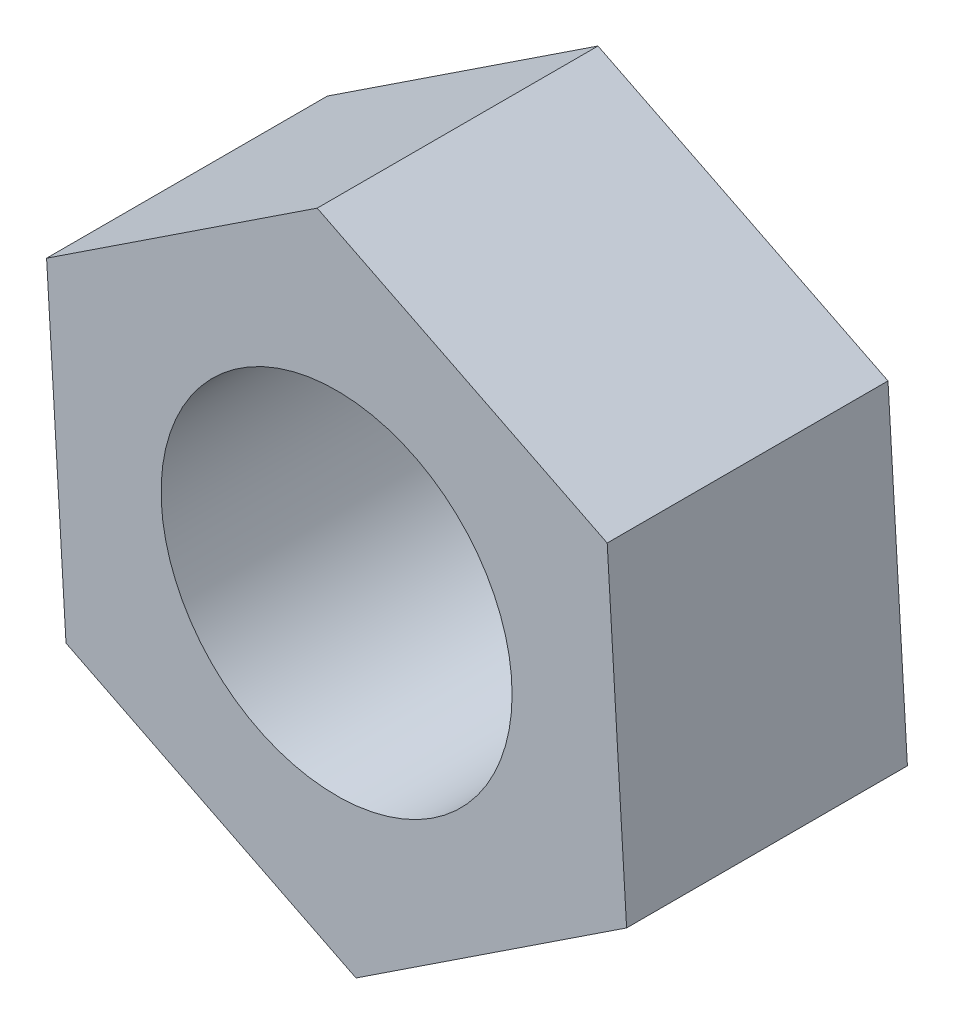
ISO-10303-21;
HEADER;
FILE_DESCRIPTION(('STEP AP214'),'2;1');
FILE_NAME('part.step','',(''),(''),'','','');
FILE_SCHEMA(('AUTOMOTIVE_DESIGN { 1 0 10303 214 1 1 1 1 }'));
ENDSEC;
DATA;
#1=APPLICATION_CONTEXT('core data for automotive mechanical design processes');
#2=APPLICATION_PROTOCOL_DEFINITION('international standard','automotive_design',2000,#1);
#3=PRODUCT_CONTEXT('',#1,'mechanical');
#4=PRODUCT('Part','Part','',(#3));
#5=PRODUCT_RELATED_PRODUCT_CATEGORY('part','',(#4));
#6=PRODUCT_DEFINITION_FORMATION('','',#4);
#7=PRODUCT_DEFINITION_CONTEXT('part definition',#1,'design');
#8=PRODUCT_DEFINITION('design','',#6,#7);
#9=PRODUCT_DEFINITION_SHAPE('','',#8);
#10=(LENGTH_UNIT() NAMED_UNIT(*) SI_UNIT(.MILLI.,.METRE.));
#11=(NAMED_UNIT(*) PLANE_ANGLE_UNIT() SI_UNIT($,.RADIAN.));
#12=(NAMED_UNIT(*) SI_UNIT($,.STERADIAN.) SOLID_ANGLE_UNIT());
#13=UNCERTAINTY_MEASURE_WITH_UNIT(LENGTH_MEASURE(1.E-05),#10,'distance_accuracy_value','');
#14=(GEOMETRIC_REPRESENTATION_CONTEXT(3) GLOBAL_UNCERTAINTY_ASSIGNED_CONTEXT((#13)) GLOBAL_UNIT_ASSIGNED_CONTEXT((#10,
#11,#12)) REPRESENTATION_CONTEXT('',''));
#15=CARTESIAN_POINT('',(0.,0.,0.));
#16=DIRECTION('',(0.,0.,1.));
#17=DIRECTION('',(1.,0.,0.));
#18=AXIS2_PLACEMENT_3D('',#15,#16,#17);
#19=CARTESIAN_POINT('',(4.13105162628889,-2.06585231666478,4.));
#20=DIRECTION('',(-0.998207253266496,-0.0598521472142535,0.));
#21=DIRECTION('',(0.0598521472142535,-0.998207253266497,0.));
#22=AXIS2_PLACEMENT_3D('',#19,#20,#21);
#23=PLANE('',#22);
#24=DIRECTION('',(-0.0598521472142535,0.998207253266496,0.));
#25=VECTOR('',#24,1.);
#26=CARTESIAN_POINT('',(4.13105162628889,-2.06585231666478,0.));
#27=LINE('',#26,#25);
#28=CARTESIAN_POINT('',(4.13105162628889,-2.06585231666478,0.));
#29=VERTEX_POINT('',#28);
#30=CARTESIAN_POINT('',(3.85460639984308,2.54466949437881,0.));
#31=VERTEX_POINT('',#30);
#32=EDGE_CURVE('E118',#29,#31,#27,.T.);
#33=ORIENTED_EDGE('',*,*,#32,.T.);
#34=DIRECTION('',(0.,0.,-1.));
#35=VECTOR('',#34,1.);
#36=CARTESIAN_POINT('',(3.85460639984308,2.54466949437881,4.));
#37=LINE('',#36,#35);
#38=CARTESIAN_POINT('',(3.85460639984308,2.54466949437881,4.));
#39=VERTEX_POINT('',#38);
#40=EDGE_CURVE('E11',#39,#31,#37,.T.);
#41=ORIENTED_EDGE('',*,*,#40,.F.);
#42=DIRECTION('',(-0.0598521472142535,0.998207253266496,0.));
#43=VECTOR('',#42,1.);
#44=CARTESIAN_POINT('',(4.13105162628889,-2.06585231666478,4.));
#45=LINE('',#44,#43);
#46=CARTESIAN_POINT('',(4.13105162628889,-2.06585231666478,4.));
#47=VERTEX_POINT('',#46);
#48=EDGE_CURVE('E128',#47,#39,#45,.T.);
#49=ORIENTED_EDGE('',*,*,#48,.F.);
#50=DIRECTION('',(0.,0.,-1.));
#51=VECTOR('',#50,1.);
#52=CARTESIAN_POINT('',(4.13105162628889,-2.06585231666478,4.));
#53=LINE('',#52,#51);
#54=EDGE_CURVE('E114',#47,#29,#53,.T.);
#55=ORIENTED_EDGE('',*,*,#54,.T.);
#56=EDGE_LOOP('',(#33,#41,#49,#55));
#57=FACE_BOUND('',#56,.T.);
#58=ADVANCED_FACE('F33',(#57),#23,.F.);
#59=CARTESIAN_POINT('',(3.85460639984308,2.54466949437881,4.));
#60=DIRECTION('',(-0.447270146674659,-0.8943989131778,0.));
#61=DIRECTION('',(0.8943989131778,-0.447270146674659,0.));
#62=AXIS2_PLACEMENT_3D('',#59,#60,#61);
#63=PLANE('',#62);
#64=DIRECTION('',(-0.8943989131778,0.447270146674659,0.));
#65=VECTOR('',#64,1.);
#66=CARTESIAN_POINT('',(3.85460639984308,2.54466949437881,0.));
#67=LINE('',#66,#65);
#68=CARTESIAN_POINT('',(-0.27644522644581,4.61052181104359,0.));
#69=VERTEX_POINT('',#68);
#70=EDGE_CURVE('E121',#31,#69,#67,.T.);
#71=ORIENTED_EDGE('',*,*,#70,.T.);
#72=DIRECTION('',(0.,0.,-1.));
#73=VECTOR('',#72,1.);
#74=CARTESIAN_POINT('',(-0.27644522644581,4.61052181104359,4.));
#75=LINE('',#74,#73);
#76=CARTESIAN_POINT('',(-0.27644522644581,4.61052181104359,4.));
#77=VERTEX_POINT('',#76);
#78=EDGE_CURVE('E42',#77,#69,#75,.T.);
#79=ORIENTED_EDGE('',*,*,#78,.F.);
#80=DIRECTION('',(-0.8943989131778,0.447270146674659,0.));
#81=VECTOR('',#80,1.);
#82=CARTESIAN_POINT('',(3.85460639984308,2.54466949437881,4.));
#83=LINE('',#82,#81);
#84=EDGE_CURVE('E87',#39,#77,#83,.T.);
#85=ORIENTED_EDGE('',*,*,#84,.F.);
#86=ORIENTED_EDGE('',*,*,#40,.T.);
#87=EDGE_LOOP('',(#71,#79,#85,#86));
#88=FACE_BOUND('',#87,.T.);
#89=ADVANCED_FACE('F154',(#88),#63,.F.);
#90=CARTESIAN_POINT('',(-0.27644522644581,4.61052181104359,4.));
#91=DIRECTION('',(0.550937106591838,-0.834546765963546,0.));
#92=DIRECTION('',(0.834546765963546,0.550937106591838,0.));
#93=AXIS2_PLACEMENT_3D('',#90,#91,#92);
#94=PLANE('',#93);
#95=DIRECTION('',(-0.834546765963546,-0.550937106591838,0.));
#96=VECTOR('',#95,1.);
#97=CARTESIAN_POINT('',(-0.27644522644581,4.61052181104359,0.));
#98=LINE('',#97,#96);
#99=CARTESIAN_POINT('',(-4.13105162628889,2.06585231666478,0.));
#100=VERTEX_POINT('',#99);
#101=EDGE_CURVE('E123',#69,#100,#98,.T.);
#102=ORIENTED_EDGE('',*,*,#101,.T.);
#103=DIRECTION('',(0.,0.,-1.));
#104=VECTOR('',#103,1.);
#105=CARTESIAN_POINT('',(-4.13105162628889,2.06585231666478,4.));
#106=LINE('',#105,#104);
#107=CARTESIAN_POINT('',(-4.13105162628889,2.06585231666478,4.));
#108=VERTEX_POINT('',#107);
#109=EDGE_CURVE('E109',#108,#100,#106,.T.);
#110=ORIENTED_EDGE('',*,*,#109,.F.);
#111=DIRECTION('',(-0.834546765963546,-0.550937106591838,0.));
#112=VECTOR('',#111,1.);
#113=CARTESIAN_POINT('',(-0.27644522644581,4.61052181104359,4.));
#114=LINE('',#113,#112);
#115=EDGE_CURVE('E100',#77,#108,#114,.T.);
#116=ORIENTED_EDGE('',*,*,#115,.F.);
#117=ORIENTED_EDGE('',*,*,#78,.T.);
#118=EDGE_LOOP('',(#102,#110,#116,#117));
#119=FACE_BOUND('',#118,.T.);
#120=ADVANCED_FACE('F135',(#119),#94,.F.);
#121=CARTESIAN_POINT('',(-4.13105162628889,2.06585231666478,4.));
#122=DIRECTION('',(0.998207253266496,0.0598521472142536,0.));
#123=DIRECTION('',(-0.0598521472142537,0.998207253266497,0.));
#124=AXIS2_PLACEMENT_3D('',#121,#122,#123);
#125=PLANE('',#124);
#126=DIRECTION('',(0.0598521472142536,-0.998207253266496,0.));
#127=VECTOR('',#126,1.);
#128=CARTESIAN_POINT('',(-4.13105162628889,2.06585231666478,0.));
#129=LINE('',#128,#127);
#130=CARTESIAN_POINT('',(-3.85460639984308,-2.54466949437881,0.));
#131=VERTEX_POINT('',#130);
#132=EDGE_CURVE('E108',#100,#131,#129,.T.);
#133=ORIENTED_EDGE('',*,*,#132,.T.);
#134=DIRECTION('',(0.,0.,-1.));
#135=VECTOR('',#134,1.);
#136=CARTESIAN_POINT('',(-3.85460639984308,-2.54466949437881,4.));
#137=LINE('',#136,#135);
#138=CARTESIAN_POINT('',(-3.85460639984308,-2.54466949437881,4.));
#139=VERTEX_POINT('',#138);
#140=EDGE_CURVE('E105',#139,#131,#137,.T.);
#141=ORIENTED_EDGE('',*,*,#140,.F.);
#142=DIRECTION('',(0.0598521472142536,-0.998207253266496,0.));
#143=VECTOR('',#142,1.);
#144=CARTESIAN_POINT('',(-4.13105162628889,2.06585231666478,4.));
#145=LINE('',#144,#143);
#146=EDGE_CURVE('E94',#108,#139,#145,.T.);
#147=ORIENTED_EDGE('',*,*,#146,.F.);
#148=ORIENTED_EDGE('',*,*,#109,.T.);
#149=EDGE_LOOP('',(#133,#141,#147,#148));
#150=FACE_BOUND('',#149,.T.);
#151=ADVANCED_FACE('F106',(#150),#125,.F.);
#152=CARTESIAN_POINT('',(-3.85460639984308,-2.54466949437881,4.));
#153=DIRECTION('',(0.447270146674659,0.8943989131778,0.));
#154=DIRECTION('',(-0.8943989131778,0.447270146674659,0.));
#155=AXIS2_PLACEMENT_3D('',#152,#153,#154);
#156=PLANE('',#155);
#157=DIRECTION('',(0.8943989131778,-0.447270146674659,0.));
#158=VECTOR('',#157,1.);
#159=CARTESIAN_POINT('',(-3.85460639984308,-2.54466949437881,0.));
#160=LINE('',#159,#158);
#161=CARTESIAN_POINT('',(0.27644522644581,-4.61052181104359,0.));
#162=VERTEX_POINT('',#161);
#163=EDGE_CURVE('E73',#131,#162,#160,.T.);
#164=ORIENTED_EDGE('',*,*,#163,.T.);
#165=DIRECTION('',(0.,0.,-1.));
#166=VECTOR('',#165,1.);
#167=CARTESIAN_POINT('',(0.27644522644581,-4.61052181104359,4.));
#168=LINE('',#167,#166);
#169=CARTESIAN_POINT('',(0.27644522644581,-4.61052181104359,4.));
#170=VERTEX_POINT('',#169);
#171=EDGE_CURVE('E110',#170,#162,#168,.T.);
#172=ORIENTED_EDGE('',*,*,#171,.F.);
#173=DIRECTION('',(0.8943989131778,-0.447270146674659,0.));
#174=VECTOR('',#173,1.);
#175=CARTESIAN_POINT('',(-3.85460639984308,-2.54466949437881,4.));
#176=LINE('',#175,#174);
#177=EDGE_CURVE('E98',#139,#170,#176,.T.);
#178=ORIENTED_EDGE('',*,*,#177,.F.);
#179=ORIENTED_EDGE('',*,*,#140,.T.);
#180=EDGE_LOOP('',(#164,#172,#178,#179));
#181=FACE_BOUND('',#180,.T.);
#182=ADVANCED_FACE('F112',(#181),#156,.F.);
#183=CARTESIAN_POINT('',(0.27644522644581,-4.61052181104359,4.));
#184=DIRECTION('',(-0.550937106591838,0.834546765963546,0.));
#185=DIRECTION('',(-0.834546765963546,-0.550937106591838,0.));
#186=AXIS2_PLACEMENT_3D('',#183,#184,#185);
#187=PLANE('',#186);
#188=DIRECTION('',(0.834546765963546,0.550937106591838,0.));
#189=VECTOR('',#188,1.);
#190=CARTESIAN_POINT('',(0.27644522644581,-4.61052181104359,0.));
#191=LINE('',#190,#189);
#192=EDGE_CURVE('E79',#162,#29,#191,.T.);
#193=ORIENTED_EDGE('',*,*,#192,.T.);
#194=ORIENTED_EDGE('',*,*,#54,.F.);
#195=DIRECTION('',(0.834546765963546,0.550937106591838,0.));
#196=VECTOR('',#195,1.);
#197=CARTESIAN_POINT('',(0.27644522644581,-4.61052181104359,4.));
#198=LINE('',#197,#196);
#199=EDGE_CURVE('E50',#170,#47,#198,.T.);
#200=ORIENTED_EDGE('',*,*,#199,.F.);
#201=ORIENTED_EDGE('',*,*,#171,.T.);
#202=EDGE_LOOP('',(#193,#194,#200,#201));
#203=FACE_BOUND('',#202,.T.);
#204=ADVANCED_FACE('F142',(#203),#187,.F.);
#205=CARTESIAN_POINT('',(0.,0.,4.));
#206=DIRECTION('',(0.,0.,1.));
#207=DIRECTION('',(1.,0.,0.));
#208=AXIS2_PLACEMENT_3D('',#205,#206,#207);
#209=PLANE('',#208);
#210=CARTESIAN_POINT('',(0.,0.,4.));
#211=DIRECTION('',(0.,0.,1.));
#212=DIRECTION('',(1.,0.,0.));
#213=AXIS2_PLACEMENT_3D('',#210,#211,#212);
#214=CIRCLE('',#213,2.5);
#215=CARTESIAN_POINT('',(2.5,0.,4.));
#216=VERTEX_POINT('',#215);
#217=EDGE_CURVE('E207',#216,#216,#214,.T.);
#218=ORIENTED_EDGE('',*,*,#217,.F.);
#219=EDGE_LOOP('',(#218));
#220=FACE_BOUND('',#219,.T.);
#221=ORIENTED_EDGE('',*,*,#48,.T.);
#222=ORIENTED_EDGE('',*,*,#84,.T.);
#223=ORIENTED_EDGE('',*,*,#115,.T.);
#224=ORIENTED_EDGE('',*,*,#146,.T.);
#225=ORIENTED_EDGE('',*,*,#177,.T.);
#226=ORIENTED_EDGE('',*,*,#199,.T.);
#227=EDGE_LOOP('',(#221,#222,#223,#224,#225,#226));
#228=FACE_BOUND('',#227,.T.);
#229=ADVANCED_FACE('F96',(#220,#228),#209,.T.);
#230=CARTESIAN_POINT('',(0.,0.,0.));
#231=DIRECTION('',(0.,0.,1.));
#232=DIRECTION('',(1.,0.,0.));
#233=AXIS2_PLACEMENT_3D('',#230,#231,#232);
#234=PLANE('',#233);
#235=CARTESIAN_POINT('',(0.,0.,0.));
#236=DIRECTION('',(0.,0.,1.));
#237=DIRECTION('',(1.,0.,0.));
#238=AXIS2_PLACEMENT_3D('',#235,#236,#237);
#239=CIRCLE('',#238,2.5);
#240=CARTESIAN_POINT('',(2.5,0.,0.));
#241=VERTEX_POINT('',#240);
#242=EDGE_CURVE('E36',#241,#241,#239,.T.);
#243=ORIENTED_EDGE('',*,*,#242,.T.);
#244=EDGE_LOOP('',(#243));
#245=FACE_BOUND('',#244,.T.);
#246=ORIENTED_EDGE('',*,*,#32,.F.);
#247=ORIENTED_EDGE('',*,*,#192,.F.);
#248=ORIENTED_EDGE('',*,*,#163,.F.);
#249=ORIENTED_EDGE('',*,*,#132,.F.);
#250=ORIENTED_EDGE('',*,*,#101,.F.);
#251=ORIENTED_EDGE('',*,*,#70,.F.);
#252=EDGE_LOOP('',(#246,#247,#248,#249,#250,#251));
#253=FACE_BOUND('',#252,.T.);
#254=ADVANCED_FACE('F138',(#245,#253),#234,.F.);
#255=CARTESIAN_POINT('',(0.,0.,-6.));
#256=DIRECTION('',(0.,0.,1.));
#257=DIRECTION('',(1.,0.,0.));
#258=AXIS2_PLACEMENT_3D('',#255,#256,#257);
#259=CYLINDRICAL_SURFACE('',#258,2.5);
#260=ORIENTED_EDGE('',*,*,#217,.T.);
#261=EDGE_LOOP('',(#260));
#262=FACE_BOUND('',#261,.T.);
#263=ORIENTED_EDGE('',*,*,#242,.F.);
#264=EDGE_LOOP('',(#263));
#265=FACE_BOUND('',#264,.T.);
#266=ADVANCED_FACE('F191',(#262,#265),#259,.F.);
#267=CLOSED_SHELL('',(#58,#89,#120,#151,#182,#204,#229,#254,#266));
#268=MANIFOLD_SOLID_BREP('B2',#267);
#269=ADVANCED_BREP_SHAPE_REPRESENTATION('',(#18,#268),#14);
#270=SHAPE_DEFINITION_REPRESENTATION(#9,#269);
ENDSEC;
END-ISO-10303-21;
